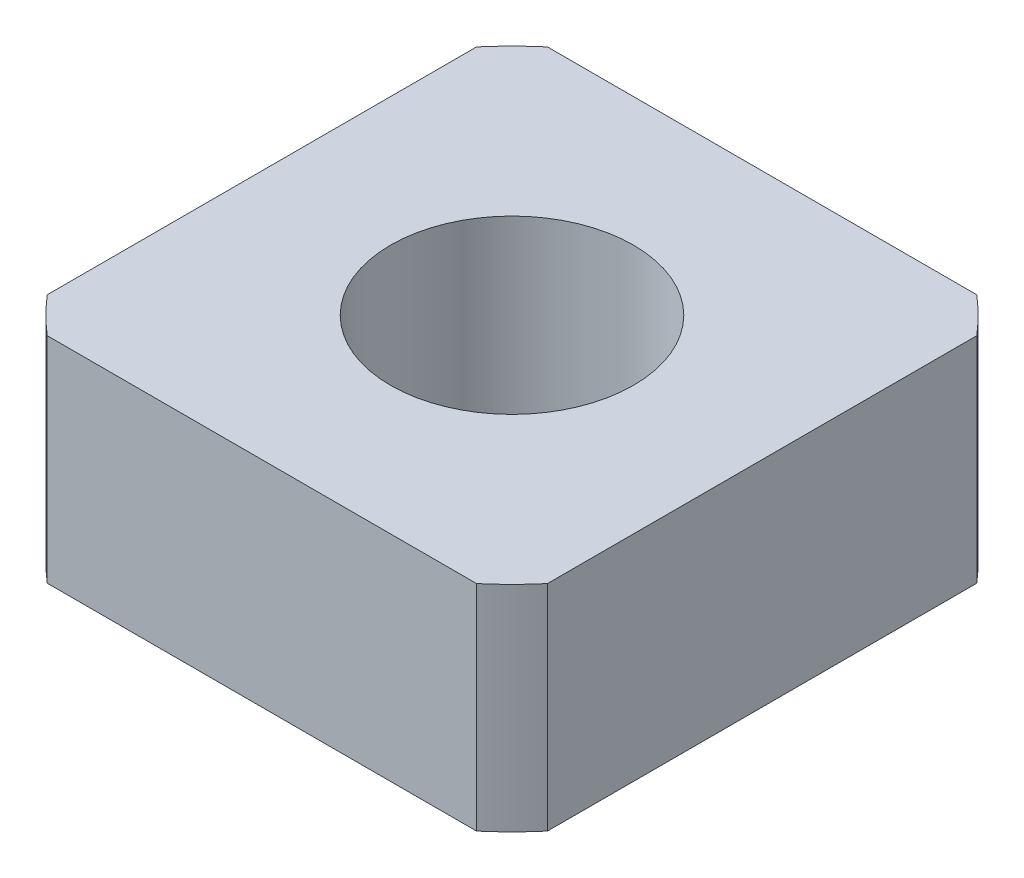
ISO-10303-21;
HEADER;
FILE_DESCRIPTION(('STEP AP214'),'2;1');
FILE_NAME('part.step','',(''),(''),'','','');
FILE_SCHEMA(('AUTOMOTIVE_DESIGN { 1 0 10303 214 1 1 1 1 }'));
ENDSEC;
DATA;
#1=APPLICATION_CONTEXT('core data for automotive mechanical design processes');
#2=APPLICATION_PROTOCOL_DEFINITION('international standard','automotive_design',2000,#1);
#3=PRODUCT_CONTEXT('',#1,'mechanical');
#4=PRODUCT('Part','Part','',(#3));
#5=PRODUCT_RELATED_PRODUCT_CATEGORY('part','',(#4));
#6=PRODUCT_DEFINITION_FORMATION('','',#4);
#7=PRODUCT_DEFINITION_CONTEXT('part definition',#1,'design');
#8=PRODUCT_DEFINITION('design','',#6,#7);
#9=PRODUCT_DEFINITION_SHAPE('','',#8);
#10=(LENGTH_UNIT() NAMED_UNIT(*) SI_UNIT(.MILLI.,.METRE.));
#11=(NAMED_UNIT(*) PLANE_ANGLE_UNIT() SI_UNIT($,.RADIAN.));
#12=(NAMED_UNIT(*) SI_UNIT($,.STERADIAN.) SOLID_ANGLE_UNIT());
#13=UNCERTAINTY_MEASURE_WITH_UNIT(LENGTH_MEASURE(1.E-05),#10,'distance_accuracy_value','');
#14=(GEOMETRIC_REPRESENTATION_CONTEXT(3) GLOBAL_UNCERTAINTY_ASSIGNED_CONTEXT((#13)) GLOBAL_UNIT_ASSIGNED_CONTEXT((#10,
#11,#12)) REPRESENTATION_CONTEXT('',''));
#15=CARTESIAN_POINT('',(0.,0.,0.));
#16=DIRECTION('',(0.,0.,1.));
#17=DIRECTION('',(1.,0.,0.));
#18=AXIS2_PLACEMENT_3D('',#15,#16,#17);
#19=CARTESIAN_POINT('',(0.,3.,0.));
#20=DIRECTION('',(0.,-1.,0.));
#21=DIRECTION('',(0.,0.,-1.));
#22=AXIS2_PLACEMENT_3D('',#19,#20,#21);
#23=CYLINDRICAL_SURFACE('',#22,4.61273307773808);
#24=CARTESIAN_POINT('',(0.,0.,0.));
#25=DIRECTION('',(0.,1.,0.));
#26=DIRECTION('',(0.,0.,1.));
#27=AXIS2_PLACEMENT_3D('',#24,#25,#26);
#28=CIRCLE('',#27,4.61273307773808);
#29=CARTESIAN_POINT('',(-3.00454762759038,0.,-3.5));
#30=VERTEX_POINT('',#29);
#31=CARTESIAN_POINT('',(-3.5,0.,-3.00454762759038));
#32=VERTEX_POINT('',#31);
#33=EDGE_CURVE('E170',#30,#32,#28,.T.);
#34=ORIENTED_EDGE('',*,*,#33,.T.);
#35=DIRECTION('',(0.,-1.,0.));
#36=VECTOR('',#35,1.);
#37=CARTESIAN_POINT('',(-3.5,3.,-3.00454762759038));
#38=LINE('',#37,#36);
#39=CARTESIAN_POINT('',(-3.5,3.,-3.00454762759038));
#40=VERTEX_POINT('',#39);
#41=EDGE_CURVE('E11',#40,#32,#38,.T.);
#42=ORIENTED_EDGE('',*,*,#41,.F.);
#43=CARTESIAN_POINT('',(0.,3.,0.));
#44=DIRECTION('',(0.,1.,0.));
#45=DIRECTION('',(0.,0.,1.));
#46=AXIS2_PLACEMENT_3D('',#43,#44,#45);
#47=CIRCLE('',#46,4.61273307773808);
#48=CARTESIAN_POINT('',(-3.00454762759038,3.,-3.5));
#49=VERTEX_POINT('',#48);
#50=EDGE_CURVE('E129',#49,#40,#47,.T.);
#51=ORIENTED_EDGE('',*,*,#50,.F.);
#52=DIRECTION('',(0.,-1.,0.));
#53=VECTOR('',#52,1.);
#54=CARTESIAN_POINT('',(-3.00454762759038,3.,-3.5));
#55=LINE('',#54,#53);
#56=EDGE_CURVE('E144',#49,#30,#55,.T.);
#57=ORIENTED_EDGE('',*,*,#56,.T.);
#58=EDGE_LOOP('',(#34,#42,#51,#57));
#59=FACE_BOUND('',#58,.T.);
#60=ADVANCED_FACE('F35',(#59),#23,.T.);
#61=CARTESIAN_POINT('',(-3.5,3.,0.));
#62=DIRECTION('',(1.,0.,0.));
#63=DIRECTION('',(0.,0.,-1.));
#64=AXIS2_PLACEMENT_3D('',#61,#62,#63);
#65=PLANE('',#64);
#66=DIRECTION('',(0.,0.,1.));
#67=VECTOR('',#66,1.);
#68=CARTESIAN_POINT('',(-3.5,0.,0.));
#69=LINE('',#68,#67);
#70=CARTESIAN_POINT('',(-3.5,0.,3.00454762759038));
#71=VERTEX_POINT('',#70);
#72=EDGE_CURVE('E164',#32,#71,#69,.T.);
#73=ORIENTED_EDGE('',*,*,#72,.T.);
#74=DIRECTION('',(0.,-1.,0.));
#75=VECTOR('',#74,1.);
#76=CARTESIAN_POINT('',(-3.5,3.,3.00454762759038));
#77=LINE('',#76,#75);
#78=CARTESIAN_POINT('',(-3.5,3.,3.00454762759038));
#79=VERTEX_POINT('',#78);
#80=EDGE_CURVE('E44',#79,#71,#77,.T.);
#81=ORIENTED_EDGE('',*,*,#80,.F.);
#82=DIRECTION('',(0.,0.,1.));
#83=VECTOR('',#82,1.);
#84=CARTESIAN_POINT('',(-3.5,3.,0.));
#85=LINE('',#84,#83);
#86=EDGE_CURVE('E95',#40,#79,#85,.T.);
#87=ORIENTED_EDGE('',*,*,#86,.F.);
#88=ORIENTED_EDGE('',*,*,#41,.T.);
#89=EDGE_LOOP('',(#73,#81,#87,#88));
#90=FACE_BOUND('',#89,.T.);
#91=ADVANCED_FACE('F37',(#90),#65,.F.);
#92=CARTESIAN_POINT('',(0.,3.,0.));
#93=DIRECTION('',(0.,-1.,0.));
#94=DIRECTION('',(0.,0.,-1.));
#95=AXIS2_PLACEMENT_3D('',#92,#93,#94);
#96=CYLINDRICAL_SURFACE('',#95,4.61273307773808);
#97=CARTESIAN_POINT('',(0.,0.,0.));
#98=DIRECTION('',(0.,1.,0.));
#99=DIRECTION('',(0.,0.,1.));
#100=AXIS2_PLACEMENT_3D('',#97,#98,#99);
#101=CIRCLE('',#100,4.61273307773808);
#102=CARTESIAN_POINT('',(-3.00454762759038,0.,3.5));
#103=VERTEX_POINT('',#102);
#104=EDGE_CURVE('E159',#71,#103,#101,.T.);
#105=ORIENTED_EDGE('',*,*,#104,.T.);
#106=DIRECTION('',(0.,-1.,0.));
#107=VECTOR('',#106,1.);
#108=CARTESIAN_POINT('',(-3.00454762759038,3.,3.5));
#109=LINE('',#108,#107);
#110=CARTESIAN_POINT('',(-3.00454762759038,3.,3.5));
#111=VERTEX_POINT('',#110);
#112=EDGE_CURVE('E151',#111,#103,#109,.T.);
#113=ORIENTED_EDGE('',*,*,#112,.F.);
#114=CARTESIAN_POINT('',(0.,3.,0.));
#115=DIRECTION('',(0.,1.,0.));
#116=DIRECTION('',(0.,0.,1.));
#117=AXIS2_PLACEMENT_3D('',#114,#115,#116);
#118=CIRCLE('',#117,4.61273307773808);
#119=EDGE_CURVE('E136',#79,#111,#118,.T.);
#120=ORIENTED_EDGE('',*,*,#119,.F.);
#121=ORIENTED_EDGE('',*,*,#80,.T.);
#122=EDGE_LOOP('',(#105,#113,#120,#121));
#123=FACE_BOUND('',#122,.T.);
#124=ADVANCED_FACE('F157',(#123),#96,.T.);
#125=CARTESIAN_POINT('',(0.,3.,3.5));
#126=DIRECTION('',(0.,0.,-1.));
#127=DIRECTION('',(-1.,0.,0.));
#128=AXIS2_PLACEMENT_3D('',#125,#126,#127);
#129=PLANE('',#128);
#130=DIRECTION('',(1.,0.,0.));
#131=VECTOR('',#130,1.);
#132=CARTESIAN_POINT('',(0.,0.,3.5));
#133=LINE('',#132,#131);
#134=CARTESIAN_POINT('',(3.00454762759038,0.,3.5));
#135=VERTEX_POINT('',#134);
#136=EDGE_CURVE('E166',#103,#135,#133,.T.);
#137=ORIENTED_EDGE('',*,*,#136,.T.);
#138=DIRECTION('',(0.,-1.,0.));
#139=VECTOR('',#138,1.);
#140=CARTESIAN_POINT('',(3.00454762759038,3.,3.5));
#141=LINE('',#140,#139);
#142=CARTESIAN_POINT('',(3.00454762759038,3.,3.5));
#143=VERTEX_POINT('',#142);
#144=EDGE_CURVE('E148',#143,#135,#141,.T.);
#145=ORIENTED_EDGE('',*,*,#144,.F.);
#146=DIRECTION('',(1.,0.,0.));
#147=VECTOR('',#146,1.);
#148=CARTESIAN_POINT('',(0.,3.,3.5));
#149=LINE('',#148,#147);
#150=EDGE_CURVE('E205',#111,#143,#149,.T.);
#151=ORIENTED_EDGE('',*,*,#150,.F.);
#152=ORIENTED_EDGE('',*,*,#112,.T.);
#153=EDGE_LOOP('',(#137,#145,#151,#152));
#154=FACE_BOUND('',#153,.T.);
#155=ADVANCED_FACE('F197',(#154),#129,.F.);
#156=CARTESIAN_POINT('',(3.5,0.,3.00454762759038));
#157=VERTEX_POINT('',#156);
#158=EDGE_CURVE('E168',#135,#157,#101,.T.);
#159=ORIENTED_EDGE('',*,*,#158,.T.);
#160=DIRECTION('',(0.,-1.,0.));
#161=VECTOR('',#160,1.);
#162=CARTESIAN_POINT('',(3.5,3.,3.00454762759038));
#163=LINE('',#162,#161);
#164=CARTESIAN_POINT('',(3.5,3.,3.00454762759038));
#165=VERTEX_POINT('',#164);
#166=EDGE_CURVE('E124',#165,#157,#163,.T.);
#167=ORIENTED_EDGE('',*,*,#166,.F.);
#168=EDGE_CURVE('E115',#143,#165,#118,.T.);
#169=ORIENTED_EDGE('',*,*,#168,.F.);
#170=ORIENTED_EDGE('',*,*,#144,.T.);
#171=EDGE_LOOP('',(#159,#167,#169,#170));
#172=FACE_BOUND('',#171,.T.);
#173=ADVANCED_FACE('F195',(#172),#96,.T.);
#174=CARTESIAN_POINT('',(3.5,3.,0.));
#175=DIRECTION('',(-1.,0.,0.));
#176=DIRECTION('',(0.,0.,1.));
#177=AXIS2_PLACEMENT_3D('',#174,#175,#176);
#178=PLANE('',#177);
#179=DIRECTION('',(0.,0.,-1.));
#180=VECTOR('',#179,1.);
#181=CARTESIAN_POINT('',(3.5,0.,0.));
#182=LINE('',#181,#180);
#183=CARTESIAN_POINT('',(3.5,0.,-3.00454762759038));
#184=VERTEX_POINT('',#183);
#185=EDGE_CURVE('E123',#157,#184,#182,.T.);
#186=ORIENTED_EDGE('',*,*,#185,.T.);
#187=DIRECTION('',(0.,-1.,0.));
#188=VECTOR('',#187,1.);
#189=CARTESIAN_POINT('',(3.5,3.,-3.00454762759038));
#190=LINE('',#189,#188);
#191=CARTESIAN_POINT('',(3.5,3.,-3.00454762759038));
#192=VERTEX_POINT('',#191);
#193=EDGE_CURVE('E120',#192,#184,#190,.T.);
#194=ORIENTED_EDGE('',*,*,#193,.F.);
#195=DIRECTION('',(0.,0.,-1.));
#196=VECTOR('',#195,1.);
#197=CARTESIAN_POINT('',(3.5,3.,0.));
#198=LINE('',#197,#196);
#199=EDGE_CURVE('E108',#165,#192,#198,.T.);
#200=ORIENTED_EDGE('',*,*,#199,.F.);
#201=ORIENTED_EDGE('',*,*,#166,.T.);
#202=EDGE_LOOP('',(#186,#194,#200,#201));
#203=FACE_BOUND('',#202,.T.);
#204=ADVANCED_FACE('F121',(#203),#178,.F.);
#205=CARTESIAN_POINT('',(3.00454762759038,0.,-3.5));
#206=VERTEX_POINT('',#205);
#207=EDGE_CURVE('E81',#184,#206,#28,.T.);
#208=ORIENTED_EDGE('',*,*,#207,.T.);
#209=DIRECTION('',(0.,-1.,0.));
#210=VECTOR('',#209,1.);
#211=CARTESIAN_POINT('',(3.00454762759038,3.,-3.5));
#212=LINE('',#211,#210);
#213=CARTESIAN_POINT('',(3.00454762759038,3.,-3.5));
#214=VERTEX_POINT('',#213);
#215=EDGE_CURVE('E125',#214,#206,#212,.T.);
#216=ORIENTED_EDGE('',*,*,#215,.F.);
#217=EDGE_CURVE('E113',#192,#214,#47,.T.);
#218=ORIENTED_EDGE('',*,*,#217,.F.);
#219=ORIENTED_EDGE('',*,*,#193,.T.);
#220=EDGE_LOOP('',(#208,#216,#218,#219));
#221=FACE_BOUND('',#220,.T.);
#222=ADVANCED_FACE('F127',(#221),#23,.T.);
#223=CARTESIAN_POINT('',(0.,3.,-3.5));
#224=DIRECTION('',(0.,0.,1.));
#225=DIRECTION('',(1.,0.,0.));
#226=AXIS2_PLACEMENT_3D('',#223,#224,#225);
#227=PLANE('',#226);
#228=DIRECTION('',(-1.,0.,0.));
#229=VECTOR('',#228,1.);
#230=CARTESIAN_POINT('',(0.,0.,-3.5));
#231=LINE('',#230,#229);
#232=EDGE_CURVE('E87',#206,#30,#231,.T.);
#233=ORIENTED_EDGE('',*,*,#232,.T.);
#234=ORIENTED_EDGE('',*,*,#56,.F.);
#235=DIRECTION('',(-1.,0.,0.));
#236=VECTOR('',#235,1.);
#237=CARTESIAN_POINT('',(0.,3.,-3.5));
#238=LINE('',#237,#236);
#239=EDGE_CURVE('E52',#214,#49,#238,.T.);
#240=ORIENTED_EDGE('',*,*,#239,.F.);
#241=ORIENTED_EDGE('',*,*,#215,.T.);
#242=EDGE_LOOP('',(#233,#234,#240,#241));
#243=FACE_BOUND('',#242,.T.);
#244=ADVANCED_FACE('F177',(#243),#227,.F.);
#245=CARTESIAN_POINT('',(0.,3.,0.));
#246=DIRECTION('',(0.,-1.,0.));
#247=DIRECTION('',(0.,0.,-1.));
#248=AXIS2_PLACEMENT_3D('',#245,#246,#247);
#249=CYLINDRICAL_SURFACE('',#248,1.7);
#250=CARTESIAN_POINT('',(0.,3.,0.));
#251=DIRECTION('',(0.,1.,0.));
#252=DIRECTION('',(0.,0.,1.));
#253=AXIS2_PLACEMENT_3D('',#250,#251,#252);
#254=CIRCLE('',#253,1.7);
#255=CARTESIAN_POINT('',(0.,3.,1.7));
#256=VERTEX_POINT('',#255);
#257=EDGE_CURVE('E130',#256,#256,#254,.T.);
#258=ORIENTED_EDGE('',*,*,#257,.T.);
#259=EDGE_LOOP('',(#258));
#260=FACE_BOUND('',#259,.T.);
#261=CARTESIAN_POINT('',(0.,0.,0.));
#262=DIRECTION('',(0.,1.,0.));
#263=DIRECTION('',(0.,0.,1.));
#264=AXIS2_PLACEMENT_3D('',#261,#262,#263);
#265=CIRCLE('',#264,1.7);
#266=CARTESIAN_POINT('',(0.,0.,1.7));
#267=VERTEX_POINT('',#266);
#268=EDGE_CURVE('E133',#267,#267,#265,.T.);
#269=ORIENTED_EDGE('',*,*,#268,.F.);
#270=EDGE_LOOP('',(#269));
#271=FACE_BOUND('',#270,.T.);
#272=ADVANCED_FACE('F179',(#260,#271),#249,.F.);
#273=CARTESIAN_POINT('',(0.,3.,0.));
#274=DIRECTION('',(0.,1.,0.));
#275=DIRECTION('',(0.,0.,1.));
#276=AXIS2_PLACEMENT_3D('',#273,#274,#275);
#277=PLANE('',#276);
#278=ORIENTED_EDGE('',*,*,#50,.T.);
#279=ORIENTED_EDGE('',*,*,#86,.T.);
#280=ORIENTED_EDGE('',*,*,#119,.T.);
#281=ORIENTED_EDGE('',*,*,#150,.T.);
#282=ORIENTED_EDGE('',*,*,#168,.T.);
#283=ORIENTED_EDGE('',*,*,#199,.T.);
#284=ORIENTED_EDGE('',*,*,#217,.T.);
#285=ORIENTED_EDGE('',*,*,#239,.T.);
#286=EDGE_LOOP('',(#278,#279,#280,#281,#282,#283,#284,#285));
#287=FACE_BOUND('',#286,.T.);
#288=ORIENTED_EDGE('',*,*,#257,.F.);
#289=EDGE_LOOP('',(#288));
#290=FACE_BOUND('',#289,.T.);
#291=ADVANCED_FACE('F110',(#287,#290),#277,.T.);
#292=CARTESIAN_POINT('',(0.,0.,0.));
#293=DIRECTION('',(0.,1.,0.));
#294=DIRECTION('',(0.,0.,1.));
#295=AXIS2_PLACEMENT_3D('',#292,#293,#294);
#296=PLANE('',#295);
#297=ORIENTED_EDGE('',*,*,#33,.F.);
#298=ORIENTED_EDGE('',*,*,#232,.F.);
#299=ORIENTED_EDGE('',*,*,#207,.F.);
#300=ORIENTED_EDGE('',*,*,#185,.F.);
#301=ORIENTED_EDGE('',*,*,#158,.F.);
#302=ORIENTED_EDGE('',*,*,#136,.F.);
#303=ORIENTED_EDGE('',*,*,#104,.F.);
#304=ORIENTED_EDGE('',*,*,#72,.F.);
#305=EDGE_LOOP('',(#297,#298,#299,#300,#301,#302,#303,#304));
#306=FACE_BOUND('',#305,.T.);
#307=ORIENTED_EDGE('',*,*,#268,.T.);
#308=EDGE_LOOP('',(#307));
#309=FACE_BOUND('',#308,.T.);
#310=ADVANCED_FACE('F163',(#306,#309),#296,.F.);
#311=CLOSED_SHELL('',(#60,#91,#124,#155,#173,#204,#222,#244,#272,#291,#310));
#312=MANIFOLD_SOLID_BREP('B2',#311);
#313=ADVANCED_BREP_SHAPE_REPRESENTATION('',(#18,#312),#14);
#314=SHAPE_DEFINITION_REPRESENTATION(#9,#313);
ENDSEC;
END-ISO-10303-21;
